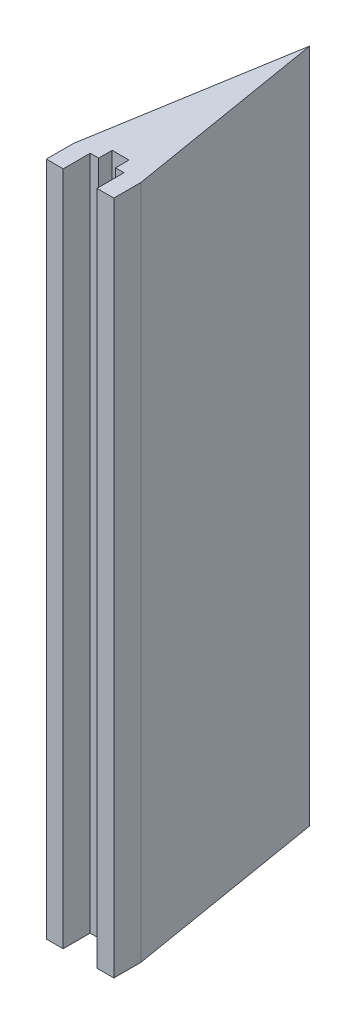
ISO-10303-21;
HEADER;
FILE_DESCRIPTION(('STEP AP214'),'2;1');
FILE_NAME('part.step','',(''),(''),'','','');
FILE_SCHEMA(('AUTOMOTIVE_DESIGN { 1 0 10303 214 1 1 1 1 }'));
ENDSEC;
DATA;
#1=APPLICATION_CONTEXT('core data for automotive mechanical design processes');
#2=APPLICATION_PROTOCOL_DEFINITION('international standard','automotive_design',2000,#1);
#3=PRODUCT_CONTEXT('',#1,'mechanical');
#4=PRODUCT('Part','Part','',(#3));
#5=PRODUCT_RELATED_PRODUCT_CATEGORY('part','',(#4));
#6=PRODUCT_DEFINITION_FORMATION('','',#4);
#7=PRODUCT_DEFINITION_CONTEXT('part definition',#1,'design');
#8=PRODUCT_DEFINITION('design','',#6,#7);
#9=PRODUCT_DEFINITION_SHAPE('','',#8);
#10=(LENGTH_UNIT() NAMED_UNIT(*) SI_UNIT(.MILLI.,.METRE.));
#11=(NAMED_UNIT(*) PLANE_ANGLE_UNIT() SI_UNIT($,.RADIAN.));
#12=(NAMED_UNIT(*) SI_UNIT($,.STERADIAN.) SOLID_ANGLE_UNIT());
#13=UNCERTAINTY_MEASURE_WITH_UNIT(LENGTH_MEASURE(1.E-05),#10,'distance_accuracy_value','');
#14=(GEOMETRIC_REPRESENTATION_CONTEXT(3) GLOBAL_UNCERTAINTY_ASSIGNED_CONTEXT((#13)) GLOBAL_UNIT_ASSIGNED_CONTEXT((#10,
#11,#12)) REPRESENTATION_CONTEXT('',''));
#15=CARTESIAN_POINT('',(0.,0.,0.));
#16=DIRECTION('',(0.,0.,1.));
#17=DIRECTION('',(1.,0.,0.));
#18=AXIS2_PLACEMENT_3D('',#15,#16,#17);
#19=CARTESIAN_POINT('',(0.,127.,-38.1));
#20=DIRECTION('',(-0.986393923832144,0.,0.164398987305357));
#21=DIRECTION('',(0.164398987305357,0.,0.986393923832144));
#22=AXIS2_PLACEMENT_3D('',#19,#20,#21);
#23=PLANE('',#22);
#24=DIRECTION('',(-0.164398987305357,0.,-0.986393923832144));
#25=VECTOR('',#24,1.);
#26=CARTESIAN_POINT('',(0.,0.,-38.1));
#27=LINE('',#26,#25);
#28=CARTESIAN_POINT('',(6.35,0.,0.));
#29=VERTEX_POINT('',#28);
#30=CARTESIAN_POINT('',(0.,0.,-38.1));
#31=VERTEX_POINT('',#30);
#32=EDGE_CURVE('E176',#29,#31,#27,.T.);
#33=ORIENTED_EDGE('',*,*,#32,.T.);
#34=DIRECTION('',(0.,-1.,0.));
#35=VECTOR('',#34,1.);
#36=CARTESIAN_POINT('',(0.,127.,-38.1));
#37=LINE('',#36,#35);
#38=CARTESIAN_POINT('',(0.,127.,-38.1));
#39=VERTEX_POINT('',#38);
#40=EDGE_CURVE('E11',#39,#31,#37,.T.);
#41=ORIENTED_EDGE('',*,*,#40,.F.);
#42=DIRECTION('',(-0.164398987305357,0.,-0.986393923832144));
#43=VECTOR('',#42,1.);
#44=CARTESIAN_POINT('',(0.,127.,-38.1));
#45=LINE('',#44,#43);
#46=CARTESIAN_POINT('',(6.35,127.,0.));
#47=VERTEX_POINT('',#46);
#48=EDGE_CURVE('E213',#47,#39,#45,.T.);
#49=ORIENTED_EDGE('',*,*,#48,.F.);
#50=DIRECTION('',(0.,-1.,0.));
#51=VECTOR('',#50,1.);
#52=CARTESIAN_POINT('',(6.35,127.,0.));
#53=LINE('',#52,#51);
#54=EDGE_CURVE('E172',#47,#29,#53,.T.);
#55=ORIENTED_EDGE('',*,*,#54,.T.);
#56=EDGE_LOOP('',(#33,#41,#49,#55));
#57=FACE_BOUND('',#56,.T.);
#58=ADVANCED_FACE('F45',(#57),#23,.F.);
#59=CARTESIAN_POINT('',(0.,127.,-38.1));
#60=DIRECTION('',(0.986393923832144,0.,0.164398987305357));
#61=DIRECTION('',(0.164398987305357,0.,-0.986393923832144));
#62=AXIS2_PLACEMENT_3D('',#59,#60,#61);
#63=PLANE('',#62);
#64=DIRECTION('',(-0.164398987305357,0.,0.986393923832144));
#65=VECTOR('',#64,1.);
#66=CARTESIAN_POINT('',(0.,0.,-38.1));
#67=LINE('',#66,#65);
#68=CARTESIAN_POINT('',(-6.35,0.,0.));
#69=VERTEX_POINT('',#68);
#70=EDGE_CURVE('E180',#31,#69,#67,.T.);
#71=ORIENTED_EDGE('',*,*,#70,.T.);
#72=DIRECTION('',(0.,-1.,0.));
#73=VECTOR('',#72,1.);
#74=CARTESIAN_POINT('',(-6.35,127.,0.));
#75=LINE('',#74,#73);
#76=CARTESIAN_POINT('',(-6.35,127.,0.));
#77=VERTEX_POINT('',#76);
#78=EDGE_CURVE('E54',#77,#69,#75,.T.);
#79=ORIENTED_EDGE('',*,*,#78,.F.);
#80=DIRECTION('',(-0.164398987305357,0.,0.986393923832144));
#81=VECTOR('',#80,1.);
#82=CARTESIAN_POINT('',(0.,127.,-38.1));
#83=LINE('',#82,#81);
#84=EDGE_CURVE('E120',#39,#77,#83,.T.);
#85=ORIENTED_EDGE('',*,*,#84,.F.);
#86=ORIENTED_EDGE('',*,*,#40,.T.);
#87=EDGE_LOOP('',(#71,#79,#85,#86));
#88=FACE_BOUND('',#87,.T.);
#89=ADVANCED_FACE('F314',(#88),#63,.F.);
#90=CARTESIAN_POINT('',(-6.35,127.,5.08));
#91=DIRECTION('',(1.,0.,0.));
#92=DIRECTION('',(0.,0.,-1.));
#93=AXIS2_PLACEMENT_3D('',#90,#91,#92);
#94=PLANE('',#93);
#95=DIRECTION('',(0.,0.,1.));
#96=VECTOR('',#95,1.);
#97=CARTESIAN_POINT('',(-6.35,0.,5.08));
#98=LINE('',#97,#96);
#99=CARTESIAN_POINT('',(-6.35,0.,5.08));
#100=VERTEX_POINT('',#99);
#101=EDGE_CURVE('E183',#69,#100,#98,.T.);
#102=ORIENTED_EDGE('',*,*,#101,.T.);
#103=DIRECTION('',(0.,-1.,0.));
#104=VECTOR('',#103,1.);
#105=CARTESIAN_POINT('',(-6.35,127.,5.08));
#106=LINE('',#105,#104);
#107=CARTESIAN_POINT('',(-6.35,127.,5.08));
#108=VERTEX_POINT('',#107);
#109=EDGE_CURVE('E244',#108,#100,#106,.T.);
#110=ORIENTED_EDGE('',*,*,#109,.F.);
#111=DIRECTION('',(0.,0.,1.));
#112=VECTOR('',#111,1.);
#113=CARTESIAN_POINT('',(-6.35,127.,5.08));
#114=LINE('',#113,#112);
#115=EDGE_CURVE('E254',#77,#108,#114,.T.);
#116=ORIENTED_EDGE('',*,*,#115,.F.);
#117=ORIENTED_EDGE('',*,*,#78,.T.);
#118=EDGE_LOOP('',(#102,#110,#116,#117));
#119=FACE_BOUND('',#118,.T.);
#120=ADVANCED_FACE('F252',(#119),#94,.F.);
#121=CARTESIAN_POINT('',(-3.175,127.,5.08));
#122=DIRECTION('',(0.,0.,-1.));
#123=DIRECTION('',(-1.,0.,0.));
#124=AXIS2_PLACEMENT_3D('',#121,#122,#123);
#125=PLANE('',#124);
#126=DIRECTION('',(1.,0.,0.));
#127=VECTOR('',#126,1.);
#128=CARTESIAN_POINT('',(-3.175,0.,5.08));
#129=LINE('',#128,#127);
#130=CARTESIAN_POINT('',(-3.175,0.,5.08));
#131=VERTEX_POINT('',#130);
#132=EDGE_CURVE('E186',#100,#131,#129,.T.);
#133=ORIENTED_EDGE('',*,*,#132,.T.);
#134=DIRECTION('',(0.,-1.,0.));
#135=VECTOR('',#134,1.);
#136=CARTESIAN_POINT('',(-3.175,127.,5.08));
#137=LINE('',#136,#135);
#138=CARTESIAN_POINT('',(-3.175,127.,5.08));
#139=VERTEX_POINT('',#138);
#140=EDGE_CURVE('E240',#139,#131,#137,.T.);
#141=ORIENTED_EDGE('',*,*,#140,.F.);
#142=DIRECTION('',(1.,0.,0.));
#143=VECTOR('',#142,1.);
#144=CARTESIAN_POINT('',(-3.175,127.,5.08));
#145=LINE('',#144,#143);
#146=EDGE_CURVE('E273',#108,#139,#145,.T.);
#147=ORIENTED_EDGE('',*,*,#146,.F.);
#148=ORIENTED_EDGE('',*,*,#109,.T.);
#149=EDGE_LOOP('',(#133,#141,#147,#148));
#150=FACE_BOUND('',#149,.T.);
#151=ADVANCED_FACE('F263',(#150),#125,.F.);
#152=CARTESIAN_POINT('',(-3.175,127.,0.));
#153=DIRECTION('',(-1.,0.,0.));
#154=DIRECTION('',(0.,0.,1.));
#155=AXIS2_PLACEMENT_3D('',#152,#153,#154);
#156=PLANE('',#155);
#157=DIRECTION('',(0.,0.,-1.));
#158=VECTOR('',#157,1.);
#159=CARTESIAN_POINT('',(-3.175,0.,0.));
#160=LINE('',#159,#158);
#161=CARTESIAN_POINT('',(-3.175,0.,0.));
#162=VERTEX_POINT('',#161);
#163=EDGE_CURVE('E189',#131,#162,#160,.T.);
#164=ORIENTED_EDGE('',*,*,#163,.T.);
#165=DIRECTION('',(0.,-1.,0.));
#166=VECTOR('',#165,1.);
#167=CARTESIAN_POINT('',(-3.175,127.,0.));
#168=LINE('',#167,#166);
#169=CARTESIAN_POINT('',(-3.175,127.,0.));
#170=VERTEX_POINT('',#169);
#171=EDGE_CURVE('E236',#170,#162,#168,.T.);
#172=ORIENTED_EDGE('',*,*,#171,.F.);
#173=DIRECTION('',(0.,0.,-1.));
#174=VECTOR('',#173,1.);
#175=CARTESIAN_POINT('',(-3.175,127.,0.));
#176=LINE('',#175,#174);
#177=EDGE_CURVE('E269',#139,#170,#176,.T.);
#178=ORIENTED_EDGE('',*,*,#177,.F.);
#179=ORIENTED_EDGE('',*,*,#140,.T.);
#180=EDGE_LOOP('',(#164,#172,#178,#179));
#181=FACE_BOUND('',#180,.T.);
#182=ADVANCED_FACE('F267',(#181),#156,.F.);
#183=CARTESIAN_POINT('',(-3.175,127.,0.));
#184=DIRECTION('',(0.,0.,-1.));
#185=DIRECTION('',(-1.,0.,0.));
#186=AXIS2_PLACEMENT_3D('',#183,#184,#185);
#187=PLANE('',#186);
#188=DIRECTION('',(1.,0.,0.));
#189=VECTOR('',#188,1.);
#190=CARTESIAN_POINT('',(-3.175,0.,0.));
#191=LINE('',#190,#189);
#192=CARTESIAN_POINT('',(-1.5875,0.,0.));
#193=VERTEX_POINT('',#192);
#194=EDGE_CURVE('E192',#162,#193,#191,.T.);
#195=ORIENTED_EDGE('',*,*,#194,.T.);
#196=DIRECTION('',(0.,-1.,0.));
#197=VECTOR('',#196,1.);
#198=CARTESIAN_POINT('',(-1.5875,127.,0.));
#199=LINE('',#198,#197);
#200=CARTESIAN_POINT('',(-1.5875,127.,0.));
#201=VERTEX_POINT('',#200);
#202=EDGE_CURVE('E232',#201,#193,#199,.T.);
#203=ORIENTED_EDGE('',*,*,#202,.F.);
#204=DIRECTION('',(1.,0.,0.));
#205=VECTOR('',#204,1.);
#206=CARTESIAN_POINT('',(-3.175,127.,0.));
#207=LINE('',#206,#205);
#208=EDGE_CURVE('E272',#170,#201,#207,.T.);
#209=ORIENTED_EDGE('',*,*,#208,.F.);
#210=ORIENTED_EDGE('',*,*,#171,.T.);
#211=EDGE_LOOP('',(#195,#203,#209,#210));
#212=FACE_BOUND('',#211,.T.);
#213=ADVANCED_FACE('F327',(#212),#187,.F.);
#214=CARTESIAN_POINT('',(-1.5875,127.,0.));
#215=DIRECTION('',(-1.,0.,0.));
#216=DIRECTION('',(0.,0.,1.));
#217=AXIS2_PLACEMENT_3D('',#214,#215,#216);
#218=PLANE('',#217);
#219=DIRECTION('',(0.,0.,-1.));
#220=VECTOR('',#219,1.);
#221=CARTESIAN_POINT('',(-1.5875,0.,0.));
#222=LINE('',#221,#220);
#223=CARTESIAN_POINT('',(-1.5875,0.,-2.54));
#224=VERTEX_POINT('',#223);
#225=EDGE_CURVE('E195',#193,#224,#222,.T.);
#226=ORIENTED_EDGE('',*,*,#225,.T.);
#227=DIRECTION('',(0.,-1.,0.));
#228=VECTOR('',#227,1.);
#229=CARTESIAN_POINT('',(-1.5875,127.,-2.54));
#230=LINE('',#229,#228);
#231=CARTESIAN_POINT('',(-1.5875,127.,-2.54));
#232=VERTEX_POINT('',#231);
#233=EDGE_CURVE('E228',#232,#224,#230,.T.);
#234=ORIENTED_EDGE('',*,*,#233,.F.);
#235=DIRECTION('',(0.,0.,-1.));
#236=VECTOR('',#235,1.);
#237=CARTESIAN_POINT('',(-1.5875,127.,0.));
#238=LINE('',#237,#236);
#239=EDGE_CURVE('E277',#201,#232,#238,.T.);
#240=ORIENTED_EDGE('',*,*,#239,.F.);
#241=ORIENTED_EDGE('',*,*,#202,.T.);
#242=EDGE_LOOP('',(#226,#234,#240,#241));
#243=FACE_BOUND('',#242,.T.);
#244=ADVANCED_FACE('F330',(#243),#218,.F.);
#245=CARTESIAN_POINT('',(-1.5875,127.,-2.54));
#246=DIRECTION('',(0.,0.,-1.));
#247=DIRECTION('',(-1.,0.,0.));
#248=AXIS2_PLACEMENT_3D('',#245,#246,#247);
#249=PLANE('',#248);
#250=DIRECTION('',(1.,0.,0.));
#251=VECTOR('',#250,1.);
#252=CARTESIAN_POINT('',(-1.5875,0.,-2.54));
#253=LINE('',#252,#251);
#254=CARTESIAN_POINT('',(1.5875,0.,-2.54));
#255=VERTEX_POINT('',#254);
#256=EDGE_CURVE('E198',#224,#255,#253,.T.);
#257=ORIENTED_EDGE('',*,*,#256,.T.);
#258=DIRECTION('',(0.,-1.,0.));
#259=VECTOR('',#258,1.);
#260=CARTESIAN_POINT('',(1.5875,127.,-2.54));
#261=LINE('',#260,#259);
#262=CARTESIAN_POINT('',(1.5875,127.,-2.54));
#263=VERTEX_POINT('',#262);
#264=EDGE_CURVE('E224',#263,#255,#261,.T.);
#265=ORIENTED_EDGE('',*,*,#264,.F.);
#266=DIRECTION('',(1.,0.,0.));
#267=VECTOR('',#266,1.);
#268=CARTESIAN_POINT('',(-1.5875,127.,-2.54));
#269=LINE('',#268,#267);
#270=EDGE_CURVE('E284',#232,#263,#269,.T.);
#271=ORIENTED_EDGE('',*,*,#270,.F.);
#272=ORIENTED_EDGE('',*,*,#233,.T.);
#273=EDGE_LOOP('',(#257,#265,#271,#272));
#274=FACE_BOUND('',#273,.T.);
#275=ADVANCED_FACE('F334',(#274),#249,.F.);
#276=CARTESIAN_POINT('',(1.5875,127.,-2.54));
#277=DIRECTION('',(1.,0.,0.));
#278=DIRECTION('',(0.,0.,-1.));
#279=AXIS2_PLACEMENT_3D('',#276,#277,#278);
#280=PLANE('',#279);
#281=DIRECTION('',(0.,0.,1.));
#282=VECTOR('',#281,1.);
#283=CARTESIAN_POINT('',(1.5875,0.,-2.54));
#284=LINE('',#283,#282);
#285=CARTESIAN_POINT('',(1.5875,0.,0.));
#286=VERTEX_POINT('',#285);
#287=EDGE_CURVE('E201',#255,#286,#284,.T.);
#288=ORIENTED_EDGE('',*,*,#287,.T.);
#289=DIRECTION('',(0.,-1.,0.));
#290=VECTOR('',#289,1.);
#291=CARTESIAN_POINT('',(1.5875,127.,0.));
#292=LINE('',#291,#290);
#293=CARTESIAN_POINT('',(1.5875,127.,0.));
#294=VERTEX_POINT('',#293);
#295=EDGE_CURVE('E220',#294,#286,#292,.T.);
#296=ORIENTED_EDGE('',*,*,#295,.F.);
#297=DIRECTION('',(0.,0.,1.));
#298=VECTOR('',#297,1.);
#299=CARTESIAN_POINT('',(1.5875,127.,-2.54));
#300=LINE('',#299,#298);
#301=EDGE_CURVE('E287',#263,#294,#300,.T.);
#302=ORIENTED_EDGE('',*,*,#301,.F.);
#303=ORIENTED_EDGE('',*,*,#264,.T.);
#304=EDGE_LOOP('',(#288,#296,#302,#303));
#305=FACE_BOUND('',#304,.T.);
#306=ADVANCED_FACE('F295',(#305),#280,.F.);
#307=CARTESIAN_POINT('',(1.5875,127.,0.));
#308=DIRECTION('',(0.,0.,-1.));
#309=DIRECTION('',(-1.,0.,0.));
#310=AXIS2_PLACEMENT_3D('',#307,#308,#309);
#311=PLANE('',#310);
#312=DIRECTION('',(1.,0.,0.));
#313=VECTOR('',#312,1.);
#314=CARTESIAN_POINT('',(1.5875,0.,0.));
#315=LINE('',#314,#313);
#316=CARTESIAN_POINT('',(3.175,0.,0.));
#317=VERTEX_POINT('',#316);
#318=EDGE_CURVE('E204',#286,#317,#315,.T.);
#319=ORIENTED_EDGE('',*,*,#318,.T.);
#320=DIRECTION('',(0.,-1.,0.));
#321=VECTOR('',#320,1.);
#322=CARTESIAN_POINT('',(3.175,127.,0.));
#323=LINE('',#322,#321);
#324=CARTESIAN_POINT('',(3.175,127.,0.));
#325=VERTEX_POINT('',#324);
#326=EDGE_CURVE('E165',#325,#317,#323,.T.);
#327=ORIENTED_EDGE('',*,*,#326,.F.);
#328=DIRECTION('',(1.,0.,0.));
#329=VECTOR('',#328,1.);
#330=CARTESIAN_POINT('',(1.5875,127.,0.));
#331=LINE('',#330,#329);
#332=EDGE_CURVE('E154',#294,#325,#331,.T.);
#333=ORIENTED_EDGE('',*,*,#332,.F.);
#334=ORIENTED_EDGE('',*,*,#295,.T.);
#335=EDGE_LOOP('',(#319,#327,#333,#334));
#336=FACE_BOUND('',#335,.T.);
#337=ADVANCED_FACE('F299',(#336),#311,.F.);
#338=CARTESIAN_POINT('',(3.175,127.,0.));
#339=DIRECTION('',(1.,0.,0.));
#340=DIRECTION('',(0.,0.,-1.));
#341=AXIS2_PLACEMENT_3D('',#338,#339,#340);
#342=PLANE('',#341);
#343=DIRECTION('',(0.,0.,1.));
#344=VECTOR('',#343,1.);
#345=CARTESIAN_POINT('',(3.175,0.,0.));
#346=LINE('',#345,#344);
#347=CARTESIAN_POINT('',(3.175,0.,5.08));
#348=VERTEX_POINT('',#347);
#349=EDGE_CURVE('E163',#317,#348,#346,.T.);
#350=ORIENTED_EDGE('',*,*,#349,.T.);
#351=DIRECTION('',(0.,-1.,0.));
#352=VECTOR('',#351,1.);
#353=CARTESIAN_POINT('',(3.175,127.,5.08));
#354=LINE('',#353,#352);
#355=CARTESIAN_POINT('',(3.175,127.,5.08));
#356=VERTEX_POINT('',#355);
#357=EDGE_CURVE('E160',#356,#348,#354,.T.);
#358=ORIENTED_EDGE('',*,*,#357,.F.);
#359=DIRECTION('',(0.,0.,1.));
#360=VECTOR('',#359,1.);
#361=CARTESIAN_POINT('',(3.175,127.,0.));
#362=LINE('',#361,#360);
#363=EDGE_CURVE('E148',#325,#356,#362,.T.);
#364=ORIENTED_EDGE('',*,*,#363,.F.);
#365=ORIENTED_EDGE('',*,*,#326,.T.);
#366=EDGE_LOOP('',(#350,#358,#364,#365));
#367=FACE_BOUND('',#366,.T.);
#368=ADVANCED_FACE('F161',(#367),#342,.F.);
#369=CARTESIAN_POINT('',(3.175,127.,5.08));
#370=DIRECTION('',(0.,0.,-1.));
#371=DIRECTION('',(-1.,0.,0.));
#372=AXIS2_PLACEMENT_3D('',#369,#370,#371);
#373=PLANE('',#372);
#374=DIRECTION('',(1.,0.,0.));
#375=VECTOR('',#374,1.);
#376=CARTESIAN_POINT('',(3.175,0.,5.08));
#377=LINE('',#376,#375);
#378=CARTESIAN_POINT('',(6.35,0.,5.08));
#379=VERTEX_POINT('',#378);
#380=EDGE_CURVE('E106',#348,#379,#377,.T.);
#381=ORIENTED_EDGE('',*,*,#380,.T.);
#382=DIRECTION('',(0.,-1.,0.));
#383=VECTOR('',#382,1.);
#384=CARTESIAN_POINT('',(6.35,127.,5.08));
#385=LINE('',#384,#383);
#386=CARTESIAN_POINT('',(6.35,127.,5.08));
#387=VERTEX_POINT('',#386);
#388=EDGE_CURVE('E166',#387,#379,#385,.T.);
#389=ORIENTED_EDGE('',*,*,#388,.F.);
#390=DIRECTION('',(1.,0.,0.));
#391=VECTOR('',#390,1.);
#392=CARTESIAN_POINT('',(3.175,127.,5.08));
#393=LINE('',#392,#391);
#394=EDGE_CURVE('E152',#356,#387,#393,.T.);
#395=ORIENTED_EDGE('',*,*,#394,.F.);
#396=ORIENTED_EDGE('',*,*,#357,.T.);
#397=EDGE_LOOP('',(#381,#389,#395,#396));
#398=FACE_BOUND('',#397,.T.);
#399=ADVANCED_FACE('F168',(#398),#373,.F.);
#400=CARTESIAN_POINT('',(6.35,127.,5.08));
#401=DIRECTION('',(-1.,0.,0.));
#402=DIRECTION('',(0.,0.,1.));
#403=AXIS2_PLACEMENT_3D('',#400,#401,#402);
#404=PLANE('',#403);
#405=DIRECTION('',(0.,0.,-1.));
#406=VECTOR('',#405,1.);
#407=CARTESIAN_POINT('',(6.35,0.,5.08));
#408=LINE('',#407,#406);
#409=EDGE_CURVE('E112',#379,#29,#408,.T.);
#410=ORIENTED_EDGE('',*,*,#409,.T.);
#411=ORIENTED_EDGE('',*,*,#54,.F.);
#412=DIRECTION('',(0.,0.,-1.));
#413=VECTOR('',#412,1.);
#414=CARTESIAN_POINT('',(6.35,127.,5.08));
#415=LINE('',#414,#413);
#416=EDGE_CURVE('E62',#387,#47,#415,.T.);
#417=ORIENTED_EDGE('',*,*,#416,.F.);
#418=ORIENTED_EDGE('',*,*,#388,.T.);
#419=EDGE_LOOP('',(#410,#411,#417,#418));
#420=FACE_BOUND('',#419,.T.);
#421=ADVANCED_FACE('F303',(#420),#404,.F.);
#422=CARTESIAN_POINT('',(0.,127.,0.));
#423=DIRECTION('',(0.,1.,0.));
#424=DIRECTION('',(0.,0.,1.));
#425=AXIS2_PLACEMENT_3D('',#422,#423,#424);
#426=PLANE('',#425);
#427=ORIENTED_EDGE('',*,*,#48,.T.);
#428=ORIENTED_EDGE('',*,*,#84,.T.);
#429=ORIENTED_EDGE('',*,*,#115,.T.);
#430=ORIENTED_EDGE('',*,*,#146,.T.);
#431=ORIENTED_EDGE('',*,*,#177,.T.);
#432=ORIENTED_EDGE('',*,*,#208,.T.);
#433=ORIENTED_EDGE('',*,*,#239,.T.);
#434=ORIENTED_EDGE('',*,*,#270,.T.);
#435=ORIENTED_EDGE('',*,*,#301,.T.);
#436=ORIENTED_EDGE('',*,*,#332,.T.);
#437=ORIENTED_EDGE('',*,*,#363,.T.);
#438=ORIENTED_EDGE('',*,*,#394,.T.);
#439=ORIENTED_EDGE('',*,*,#416,.T.);
#440=EDGE_LOOP('',(#427,#428,#429,#430,#431,#432,#433,#434,#435,#436,#437,#438,#439));
#441=FACE_BOUND('',#440,.T.);
#442=ADVANCED_FACE('F150',(#441),#426,.T.);
#443=CARTESIAN_POINT('',(0.,0.,0.));
#444=DIRECTION('',(0.,1.,0.));
#445=DIRECTION('',(0.,0.,1.));
#446=AXIS2_PLACEMENT_3D('',#443,#444,#445);
#447=PLANE('',#446);
#448=ORIENTED_EDGE('',*,*,#32,.F.);
#449=ORIENTED_EDGE('',*,*,#409,.F.);
#450=ORIENTED_EDGE('',*,*,#380,.F.);
#451=ORIENTED_EDGE('',*,*,#349,.F.);
#452=ORIENTED_EDGE('',*,*,#318,.F.);
#453=ORIENTED_EDGE('',*,*,#287,.F.);
#454=ORIENTED_EDGE('',*,*,#256,.F.);
#455=ORIENTED_EDGE('',*,*,#225,.F.);
#456=ORIENTED_EDGE('',*,*,#194,.F.);
#457=ORIENTED_EDGE('',*,*,#163,.F.);
#458=ORIENTED_EDGE('',*,*,#132,.F.);
#459=ORIENTED_EDGE('',*,*,#101,.F.);
#460=ORIENTED_EDGE('',*,*,#70,.F.);
#461=EDGE_LOOP('',(#448,#449,#450,#451,#452,#453,#454,#455,#456,#457,#458,#459,#460));
#462=FACE_BOUND('',#461,.T.);
#463=ADVANCED_FACE('F258',(#462),#447,.F.);
#464=CLOSED_SHELL('',(#58,#89,#120,#151,#182,#213,#244,#275,#306,#337,#368,#399,#421,#442,#463));
#465=MANIFOLD_SOLID_BREP('B2',#464);
#466=ADVANCED_BREP_SHAPE_REPRESENTATION('',(#18,#465),#14);
#467=SHAPE_DEFINITION_REPRESENTATION(#9,#466);
ENDSEC;
END-ISO-10303-21;
